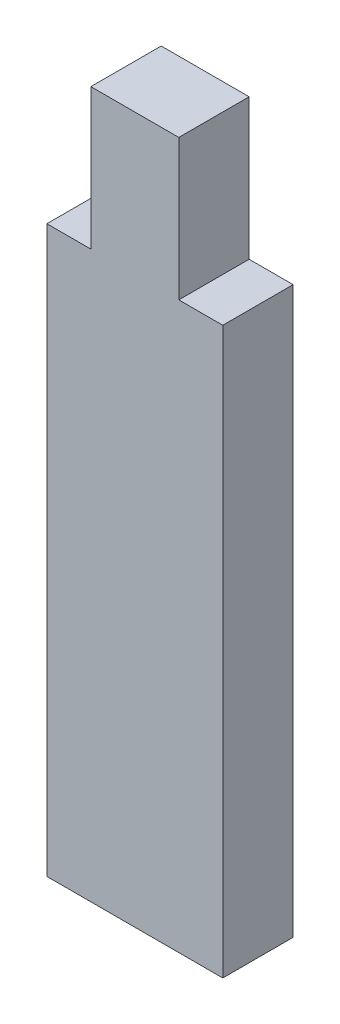
ISO-10303-21;
HEADER;
FILE_DESCRIPTION(('STEP AP214'),'2;1');
FILE_NAME('part.step','',(''),(''),'','','');
FILE_SCHEMA(('AUTOMOTIVE_DESIGN { 1 0 10303 214 1 1 1 1 }'));
ENDSEC;
DATA;
#1=APPLICATION_CONTEXT('core data for automotive mechanical design processes');
#2=APPLICATION_PROTOCOL_DEFINITION('international standard','automotive_design',2000,#1);
#3=PRODUCT_CONTEXT('',#1,'mechanical');
#4=PRODUCT('Part','Part','',(#3));
#5=PRODUCT_RELATED_PRODUCT_CATEGORY('part','',(#4));
#6=PRODUCT_DEFINITION_FORMATION('','',#4);
#7=PRODUCT_DEFINITION_CONTEXT('part definition',#1,'design');
#8=PRODUCT_DEFINITION('design','',#6,#7);
#9=PRODUCT_DEFINITION_SHAPE('','',#8);
#10=(LENGTH_UNIT() NAMED_UNIT(*) SI_UNIT(.MILLI.,.METRE.));
#11=(NAMED_UNIT(*) PLANE_ANGLE_UNIT() SI_UNIT($,.RADIAN.));
#12=(NAMED_UNIT(*) SI_UNIT($,.STERADIAN.) SOLID_ANGLE_UNIT());
#13=UNCERTAINTY_MEASURE_WITH_UNIT(LENGTH_MEASURE(1.E-05),#10,'distance_accuracy_value','');
#14=(GEOMETRIC_REPRESENTATION_CONTEXT(3) GLOBAL_UNCERTAINTY_ASSIGNED_CONTEXT((#13)) GLOBAL_UNIT_ASSIGNED_CONTEXT((#10,
#11,#12)) REPRESENTATION_CONTEXT('',''));
#15=CARTESIAN_POINT('',(0.,0.,0.));
#16=DIRECTION('',(0.,0.,1.));
#17=DIRECTION('',(1.,0.,0.));
#18=AXIS2_PLACEMENT_3D('',#15,#16,#17);
#19=CARTESIAN_POINT('',(10.,0.,4.));
#20=DIRECTION('',(0.,1.,0.));
#21=DIRECTION('',(0.,0.,1.));
#22=AXIS2_PLACEMENT_3D('',#19,#20,#21);
#23=PLANE('',#22);
#24=DIRECTION('',(1.,0.,0.));
#25=VECTOR('',#24,1.);
#26=CARTESIAN_POINT('',(10.,0.,0.));
#27=LINE('',#26,#25);
#28=CARTESIAN_POINT('',(0.,0.,0.));
#29=VERTEX_POINT('',#28);
#30=CARTESIAN_POINT('',(10.,0.,0.));
#31=VERTEX_POINT('',#30);
#32=EDGE_CURVE('E130',#29,#31,#27,.T.);
#33=ORIENTED_EDGE('',*,*,#32,.T.);
#34=DIRECTION('',(0.,0.,-1.));
#35=VECTOR('',#34,1.);
#36=CARTESIAN_POINT('',(10.,0.,4.));
#37=LINE('',#36,#35);
#38=CARTESIAN_POINT('',(10.,0.,4.));
#39=VERTEX_POINT('',#38);
#40=EDGE_CURVE('E11',#39,#31,#37,.T.);
#41=ORIENTED_EDGE('',*,*,#40,.F.);
#42=DIRECTION('',(1.,0.,0.));
#43=VECTOR('',#42,1.);
#44=CARTESIAN_POINT('',(10.,0.,4.));
#45=LINE('',#44,#43);
#46=CARTESIAN_POINT('',(0.,0.,4.));
#47=VERTEX_POINT('',#46);
#48=EDGE_CURVE('E144',#47,#39,#45,.T.);
#49=ORIENTED_EDGE('',*,*,#48,.F.);
#50=DIRECTION('',(0.,0.,-1.));
#51=VECTOR('',#50,1.);
#52=CARTESIAN_POINT('',(0.,0.,4.));
#53=LINE('',#52,#51);
#54=EDGE_CURVE('E126',#47,#29,#53,.T.);
#55=ORIENTED_EDGE('',*,*,#54,.T.);
#56=EDGE_LOOP('',(#33,#41,#49,#55));
#57=FACE_BOUND('',#56,.T.);
#58=ADVANCED_FACE('F34',(#57),#23,.F.);
#59=CARTESIAN_POINT('',(10.,32.14,4.));
#60=DIRECTION('',(-1.,0.,0.));
#61=DIRECTION('',(0.,0.,1.));
#62=AXIS2_PLACEMENT_3D('',#59,#60,#61);
#63=PLANE('',#62);
#64=DIRECTION('',(0.,1.,0.));
#65=VECTOR('',#64,1.);
#66=CARTESIAN_POINT('',(10.,32.14,0.));
#67=LINE('',#66,#65);
#68=CARTESIAN_POINT('',(10.,32.14,0.));
#69=VERTEX_POINT('',#68);
#70=EDGE_CURVE('E133',#31,#69,#67,.T.);
#71=ORIENTED_EDGE('',*,*,#70,.T.);
#72=DIRECTION('',(0.,0.,-1.));
#73=VECTOR('',#72,1.);
#74=CARTESIAN_POINT('',(10.,32.14,4.));
#75=LINE('',#74,#73);
#76=CARTESIAN_POINT('',(10.,32.14,4.));
#77=VERTEX_POINT('',#76);
#78=EDGE_CURVE('E42',#77,#69,#75,.T.);
#79=ORIENTED_EDGE('',*,*,#78,.F.);
#80=DIRECTION('',(0.,1.,0.));
#81=VECTOR('',#80,1.);
#82=CARTESIAN_POINT('',(10.,32.14,4.));
#83=LINE('',#82,#81);
#84=EDGE_CURVE('E93',#39,#77,#83,.T.);
#85=ORIENTED_EDGE('',*,*,#84,.F.);
#86=ORIENTED_EDGE('',*,*,#40,.T.);
#87=EDGE_LOOP('',(#71,#79,#85,#86));
#88=FACE_BOUND('',#87,.T.);
#89=ADVANCED_FACE('F179',(#88),#63,.F.);
#90=CARTESIAN_POINT('',(7.5,32.14,4.));
#91=DIRECTION('',(0.,-1.,0.));
#92=DIRECTION('',(0.,0.,-1.));
#93=AXIS2_PLACEMENT_3D('',#90,#91,#92);
#94=PLANE('',#93);
#95=DIRECTION('',(-1.,0.,0.));
#96=VECTOR('',#95,1.);
#97=CARTESIAN_POINT('',(7.5,32.14,0.));
#98=LINE('',#97,#96);
#99=CARTESIAN_POINT('',(7.5,32.14,0.));
#100=VERTEX_POINT('',#99);
#101=EDGE_CURVE('E135',#69,#100,#98,.T.);
#102=ORIENTED_EDGE('',*,*,#101,.T.);
#103=DIRECTION('',(0.,0.,-1.));
#104=VECTOR('',#103,1.);
#105=CARTESIAN_POINT('',(7.5,32.14,4.));
#106=LINE('',#105,#104);
#107=CARTESIAN_POINT('',(7.5,32.14,4.));
#108=VERTEX_POINT('',#107);
#109=EDGE_CURVE('E151',#108,#100,#106,.T.);
#110=ORIENTED_EDGE('',*,*,#109,.F.);
#111=DIRECTION('',(-1.,0.,0.));
#112=VECTOR('',#111,1.);
#113=CARTESIAN_POINT('',(7.5,32.14,4.));
#114=LINE('',#113,#112);
#115=EDGE_CURVE('E159',#77,#108,#114,.T.);
#116=ORIENTED_EDGE('',*,*,#115,.F.);
#117=ORIENTED_EDGE('',*,*,#78,.T.);
#118=EDGE_LOOP('',(#102,#110,#116,#117));
#119=FACE_BOUND('',#118,.T.);
#120=ADVANCED_FACE('F157',(#119),#94,.F.);
#121=CARTESIAN_POINT('',(7.5,40.14,4.));
#122=DIRECTION('',(-1.,0.,0.));
#123=DIRECTION('',(0.,-1.,0.));
#124=AXIS2_PLACEMENT_3D('',#121,#122,#123);
#125=PLANE('',#124);
#126=DIRECTION('',(0.,1.,0.));
#127=VECTOR('',#126,1.);
#128=CARTESIAN_POINT('',(7.5,40.14,0.));
#129=LINE('',#128,#127);
#130=CARTESIAN_POINT('',(7.5,40.14,0.));
#131=VERTEX_POINT('',#130);
#132=EDGE_CURVE('E137',#100,#131,#129,.T.);
#133=ORIENTED_EDGE('',*,*,#132,.T.);
#134=DIRECTION('',(0.,0.,-1.));
#135=VECTOR('',#134,1.);
#136=CARTESIAN_POINT('',(7.5,40.14,4.));
#137=LINE('',#136,#135);
#138=CARTESIAN_POINT('',(7.5,40.14,4.));
#139=VERTEX_POINT('',#138);
#140=EDGE_CURVE('E148',#139,#131,#137,.T.);
#141=ORIENTED_EDGE('',*,*,#140,.F.);
#142=DIRECTION('',(0.,1.,0.));
#143=VECTOR('',#142,1.);
#144=CARTESIAN_POINT('',(7.5,40.14,4.));
#145=LINE('',#144,#143);
#146=EDGE_CURVE('E171',#108,#139,#145,.T.);
#147=ORIENTED_EDGE('',*,*,#146,.F.);
#148=ORIENTED_EDGE('',*,*,#109,.T.);
#149=EDGE_LOOP('',(#133,#141,#147,#148));
#150=FACE_BOUND('',#149,.T.);
#151=ADVANCED_FACE('F167',(#150),#125,.F.);
#152=CARTESIAN_POINT('',(2.5,40.14,4.));
#153=DIRECTION('',(0.,-1.,0.));
#154=DIRECTION('',(0.,0.,-1.));
#155=AXIS2_PLACEMENT_3D('',#152,#153,#154);
#156=PLANE('',#155);
#157=DIRECTION('',(-1.,0.,0.));
#158=VECTOR('',#157,1.);
#159=CARTESIAN_POINT('',(2.5,40.14,0.));
#160=LINE('',#159,#158);
#161=CARTESIAN_POINT('',(2.5,40.14,0.));
#162=VERTEX_POINT('',#161);
#163=EDGE_CURVE('E139',#131,#162,#160,.T.);
#164=ORIENTED_EDGE('',*,*,#163,.T.);
#165=DIRECTION('',(0.,0.,-1.));
#166=VECTOR('',#165,1.);
#167=CARTESIAN_POINT('',(2.5,40.14,4.));
#168=LINE('',#167,#166);
#169=CARTESIAN_POINT('',(2.5,40.14,4.));
#170=VERTEX_POINT('',#169);
#171=EDGE_CURVE('E121',#170,#162,#168,.T.);
#172=ORIENTED_EDGE('',*,*,#171,.F.);
#173=DIRECTION('',(-1.,0.,0.));
#174=VECTOR('',#173,1.);
#175=CARTESIAN_POINT('',(2.5,40.14,4.));
#176=LINE('',#175,#174);
#177=EDGE_CURVE('E112',#139,#170,#176,.T.);
#178=ORIENTED_EDGE('',*,*,#177,.F.);
#179=ORIENTED_EDGE('',*,*,#140,.T.);
#180=EDGE_LOOP('',(#164,#172,#178,#179));
#181=FACE_BOUND('',#180,.T.);
#182=ADVANCED_FACE('F170',(#181),#156,.F.);
#183=CARTESIAN_POINT('',(2.5,32.14,4.));
#184=DIRECTION('',(1.,0.,0.));
#185=DIRECTION('',(0.,0.,-1.));
#186=AXIS2_PLACEMENT_3D('',#183,#184,#185);
#187=PLANE('',#186);
#188=DIRECTION('',(0.,-1.,0.));
#189=VECTOR('',#188,1.);
#190=CARTESIAN_POINT('',(2.5,32.14,0.));
#191=LINE('',#190,#189);
#192=CARTESIAN_POINT('',(2.5,32.14,0.));
#193=VERTEX_POINT('',#192);
#194=EDGE_CURVE('E120',#162,#193,#191,.T.);
#195=ORIENTED_EDGE('',*,*,#194,.T.);
#196=DIRECTION('',(0.,0.,-1.));
#197=VECTOR('',#196,1.);
#198=CARTESIAN_POINT('',(2.5,32.14,4.));
#199=LINE('',#198,#197);
#200=CARTESIAN_POINT('',(2.5,32.14,4.));
#201=VERTEX_POINT('',#200);
#202=EDGE_CURVE('E117',#201,#193,#199,.T.);
#203=ORIENTED_EDGE('',*,*,#202,.F.);
#204=DIRECTION('',(0.,-1.,0.));
#205=VECTOR('',#204,1.);
#206=CARTESIAN_POINT('',(2.5,32.14,4.));
#207=LINE('',#206,#205);
#208=EDGE_CURVE('E106',#170,#201,#207,.T.);
#209=ORIENTED_EDGE('',*,*,#208,.F.);
#210=ORIENTED_EDGE('',*,*,#171,.T.);
#211=EDGE_LOOP('',(#195,#203,#209,#210));
#212=FACE_BOUND('',#211,.T.);
#213=ADVANCED_FACE('F118',(#212),#187,.F.);
#214=CARTESIAN_POINT('',(0.,32.14,4.));
#215=DIRECTION('',(0.,-1.,0.));
#216=DIRECTION('',(0.,0.,-1.));
#217=AXIS2_PLACEMENT_3D('',#214,#215,#216);
#218=PLANE('',#217);
#219=DIRECTION('',(-1.,0.,0.));
#220=VECTOR('',#219,1.);
#221=CARTESIAN_POINT('',(0.,32.14,0.));
#222=LINE('',#221,#220);
#223=CARTESIAN_POINT('',(0.,32.14,0.));
#224=VERTEX_POINT('',#223);
#225=EDGE_CURVE('E79',#193,#224,#222,.T.);
#226=ORIENTED_EDGE('',*,*,#225,.T.);
#227=DIRECTION('',(0.,0.,-1.));
#228=VECTOR('',#227,1.);
#229=CARTESIAN_POINT('',(0.,32.14,4.));
#230=LINE('',#229,#228);
#231=CARTESIAN_POINT('',(0.,32.14,4.));
#232=VERTEX_POINT('',#231);
#233=EDGE_CURVE('E122',#232,#224,#230,.T.);
#234=ORIENTED_EDGE('',*,*,#233,.F.);
#235=DIRECTION('',(-1.,0.,0.));
#236=VECTOR('',#235,1.);
#237=CARTESIAN_POINT('',(0.,32.14,4.));
#238=LINE('',#237,#236);
#239=EDGE_CURVE('E110',#201,#232,#238,.T.);
#240=ORIENTED_EDGE('',*,*,#239,.F.);
#241=ORIENTED_EDGE('',*,*,#202,.T.);
#242=EDGE_LOOP('',(#226,#234,#240,#241));
#243=FACE_BOUND('',#242,.T.);
#244=ADVANCED_FACE('F124',(#243),#218,.F.);
#245=CARTESIAN_POINT('',(0.,0.,4.));
#246=DIRECTION('',(1.,0.,0.));
#247=DIRECTION('',(0.,0.,-1.));
#248=AXIS2_PLACEMENT_3D('',#245,#246,#247);
#249=PLANE('',#248);
#250=DIRECTION('',(0.,-1.,0.));
#251=VECTOR('',#250,1.);
#252=CARTESIAN_POINT('',(0.,0.,0.));
#253=LINE('',#252,#251);
#254=EDGE_CURVE('E85',#224,#29,#253,.T.);
#255=ORIENTED_EDGE('',*,*,#254,.T.);
#256=ORIENTED_EDGE('',*,*,#54,.F.);
#257=DIRECTION('',(0.,-1.,0.));
#258=VECTOR('',#257,1.);
#259=CARTESIAN_POINT('',(0.,0.,4.));
#260=LINE('',#259,#258);
#261=EDGE_CURVE('E50',#232,#47,#260,.T.);
#262=ORIENTED_EDGE('',*,*,#261,.F.);
#263=ORIENTED_EDGE('',*,*,#233,.T.);
#264=EDGE_LOOP('',(#255,#256,#262,#263));
#265=FACE_BOUND('',#264,.T.);
#266=ADVANCED_FACE('F195',(#265),#249,.F.);
#267=CARTESIAN_POINT('',(0.,0.,4.));
#268=DIRECTION('',(0.,0.,-1.));
#269=DIRECTION('',(-1.,0.,0.));
#270=AXIS2_PLACEMENT_3D('',#267,#268,#269);
#271=PLANE('',#270);
#272=ORIENTED_EDGE('',*,*,#48,.T.);
#273=ORIENTED_EDGE('',*,*,#84,.T.);
#274=ORIENTED_EDGE('',*,*,#115,.T.);
#275=ORIENTED_EDGE('',*,*,#146,.T.);
#276=ORIENTED_EDGE('',*,*,#177,.T.);
#277=ORIENTED_EDGE('',*,*,#208,.T.);
#278=ORIENTED_EDGE('',*,*,#239,.T.);
#279=ORIENTED_EDGE('',*,*,#261,.T.);
#280=EDGE_LOOP('',(#272,#273,#274,#275,#276,#277,#278,#279));
#281=FACE_BOUND('',#280,.T.);
#282=ADVANCED_FACE('F108',(#281),#271,.F.);
#283=CARTESIAN_POINT('',(0.,0.,0.));
#284=DIRECTION('',(0.,0.,-1.));
#285=DIRECTION('',(-1.,0.,0.));
#286=AXIS2_PLACEMENT_3D('',#283,#284,#285);
#287=PLANE('',#286);
#288=ORIENTED_EDGE('',*,*,#32,.F.);
#289=ORIENTED_EDGE('',*,*,#254,.F.);
#290=ORIENTED_EDGE('',*,*,#225,.F.);
#291=ORIENTED_EDGE('',*,*,#194,.F.);
#292=ORIENTED_EDGE('',*,*,#163,.F.);
#293=ORIENTED_EDGE('',*,*,#132,.F.);
#294=ORIENTED_EDGE('',*,*,#101,.F.);
#295=ORIENTED_EDGE('',*,*,#70,.F.);
#296=EDGE_LOOP('',(#288,#289,#290,#291,#292,#293,#294,#295));
#297=FACE_BOUND('',#296,.T.);
#298=ADVANCED_FACE('F163',(#297),#287,.T.);
#299=CLOSED_SHELL('',(#58,#89,#120,#151,#182,#213,#244,#266,#282,#298));
#300=MANIFOLD_SOLID_BREP('B2',#299);
#301=ADVANCED_BREP_SHAPE_REPRESENTATION('',(#18,#300),#14);
#302=SHAPE_DEFINITION_REPRESENTATION(#9,#301);
ENDSEC;
END-ISO-10303-21;
